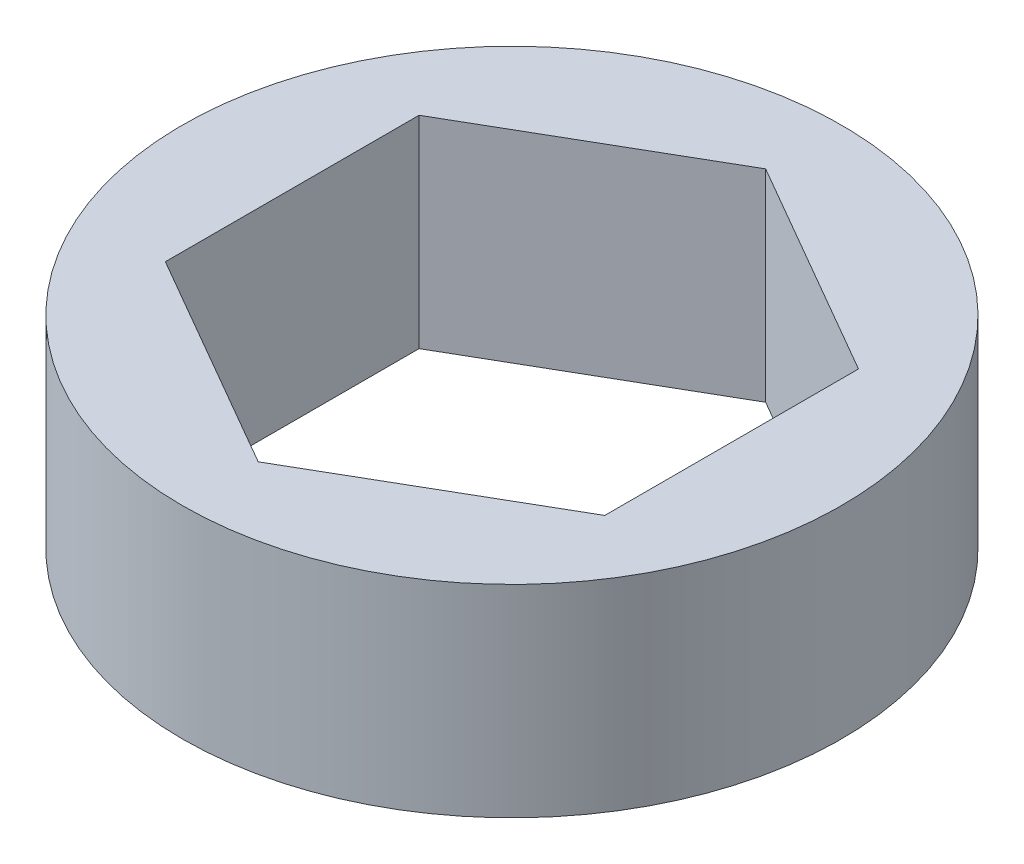
ISO-10303-21;
HEADER;
FILE_DESCRIPTION(('STEP AP214'),'2;1');
FILE_NAME('part.step','',(''),(''),'','','');
FILE_SCHEMA(('AUTOMOTIVE_DESIGN { 1 0 10303 214 1 1 1 1 }'));
ENDSEC;
DATA;
#1=APPLICATION_CONTEXT('core data for automotive mechanical design processes');
#2=APPLICATION_PROTOCOL_DEFINITION('international standard','automotive_design',2000,#1);
#3=PRODUCT_CONTEXT('',#1,'mechanical');
#4=PRODUCT('Part','Part','',(#3));
#5=PRODUCT_RELATED_PRODUCT_CATEGORY('part','',(#4));
#6=PRODUCT_DEFINITION_FORMATION('','',#4);
#7=PRODUCT_DEFINITION_CONTEXT('part definition',#1,'design');
#8=PRODUCT_DEFINITION('design','',#6,#7);
#9=PRODUCT_DEFINITION_SHAPE('','',#8);
#10=(LENGTH_UNIT() NAMED_UNIT(*) SI_UNIT(.MILLI.,.METRE.));
#11=(NAMED_UNIT(*) PLANE_ANGLE_UNIT() SI_UNIT($,.RADIAN.));
#12=(NAMED_UNIT(*) SI_UNIT($,.STERADIAN.) SOLID_ANGLE_UNIT());
#13=UNCERTAINTY_MEASURE_WITH_UNIT(LENGTH_MEASURE(1.E-05),#10,'distance_accuracy_value','');
#14=(GEOMETRIC_REPRESENTATION_CONTEXT(3) GLOBAL_UNCERTAINTY_ASSIGNED_CONTEXT((#13)) GLOBAL_UNIT_ASSIGNED_CONTEXT((#10,
#11,#12)) REPRESENTATION_CONTEXT('',''));
#15=CARTESIAN_POINT('',(0.,0.,0.));
#16=DIRECTION('',(0.,0.,1.));
#17=DIRECTION('',(1.,0.,0.));
#18=AXIS2_PLACEMENT_3D('',#15,#16,#17);
#19=CARTESIAN_POINT('',(0.,5.842,0.));
#20=DIRECTION('',(0.,1.,0.));
#21=DIRECTION('',(0.,0.,1.));
#22=AXIS2_PLACEMENT_3D('',#19,#20,#21);
#23=PLANE('',#22);
#24=CARTESIAN_POINT('',(0.,5.842,0.));
#25=DIRECTION('',(0.,1.,0.));
#26=DIRECTION('',(0.,0.,1.));
#27=AXIS2_PLACEMENT_3D('',#24,#25,#26);
#28=CIRCLE('',#27,9.525);
#29=CARTESIAN_POINT('',(0.,5.842,9.525));
#30=VERTEX_POINT('',#29);
#31=EDGE_CURVE('E11',#30,#30,#28,.T.);
#32=ORIENTED_EDGE('',*,*,#31,.T.);
#33=EDGE_LOOP('',(#32));
#34=FACE_BOUND('',#33,.T.);
#35=DIRECTION('',(-0.866025403784438,0.,0.500000000000001));
#36=VECTOR('',#35,1.);
#37=CARTESIAN_POINT('',(0.,5.842,-7.33234841870823));
#38=LINE('',#37,#36);
#39=CARTESIAN_POINT('',(0.,5.842,-7.33234841870823));
#40=VERTEX_POINT('',#39);
#41=CARTESIAN_POINT('',(-6.35,5.842,-3.6661742093541));
#42=VERTEX_POINT('',#41);
#43=EDGE_CURVE('E96',#40,#42,#38,.T.);
#44=ORIENTED_EDGE('',*,*,#43,.F.);
#45=DIRECTION('',(-0.866025403784442,0.,-0.499999999999995));
#46=VECTOR('',#45,1.);
#47=CARTESIAN_POINT('',(6.34999999999995,5.842,-3.66617420935419));
#48=LINE('',#47,#46);
#49=CARTESIAN_POINT('',(6.34999999999995,5.842,-3.66617420935419));
#50=VERTEX_POINT('',#49);
#51=EDGE_CURVE('E88',#50,#40,#48,.T.);
#52=ORIENTED_EDGE('',*,*,#51,.F.);
#53=DIRECTION('',(0.,0.,-1.));
#54=VECTOR('',#53,1.);
#55=CARTESIAN_POINT('',(6.35000000000002,5.842,3.66617420935406));
#56=LINE('',#55,#54);
#57=CARTESIAN_POINT('',(6.35000000000002,5.842,3.66617420935406));
#58=VERTEX_POINT('',#57);
#59=EDGE_CURVE('E116',#58,#50,#56,.T.);
#60=ORIENTED_EDGE('',*,*,#59,.F.);
#61=DIRECTION('',(0.866025403784434,0.,-0.500000000000007));
#62=VECTOR('',#61,1.);
#63=CARTESIAN_POINT('',(0.,5.842,7.33234841870823));
#64=LINE('',#63,#62);
#65=CARTESIAN_POINT('',(0.,5.842,7.33234841870823));
#66=VERTEX_POINT('',#65);
#67=EDGE_CURVE('E114',#66,#58,#64,.T.);
#68=ORIENTED_EDGE('',*,*,#67,.F.);
#69=DIRECTION('',(0.866025403784442,0.,0.499999999999995));
#70=VECTOR('',#69,1.);
#71=CARTESIAN_POINT('',(-6.34999999999997,5.842,3.66617420935415));
#72=LINE('',#71,#70);
#73=CARTESIAN_POINT('',(-6.34999999999997,5.842,3.66617420935415));
#74=VERTEX_POINT('',#73);
#75=EDGE_CURVE('E110',#74,#66,#72,.T.);
#76=ORIENTED_EDGE('',*,*,#75,.F.);
#77=DIRECTION('',(0.,0.,1.));
#78=VECTOR('',#77,1.);
#79=CARTESIAN_POINT('',(-6.35,5.842,-3.6661742093541));
#80=LINE('',#79,#78);
#81=EDGE_CURVE('E108',#42,#74,#80,.T.);
#82=ORIENTED_EDGE('',*,*,#81,.F.);
#83=EDGE_LOOP('',(#44,#52,#60,#68,#76,#82));
#84=FACE_BOUND('',#83,.T.);
#85=ADVANCED_FACE('F35',(#34,#84),#23,.T.);
#86=CARTESIAN_POINT('',(0.,0.,0.));
#87=DIRECTION('',(0.,1.,0.));
#88=DIRECTION('',(0.,0.,1.));
#89=AXIS2_PLACEMENT_3D('',#86,#87,#88);
#90=PLANE('',#89);
#91=CARTESIAN_POINT('',(0.,0.,0.));
#92=DIRECTION('',(0.,1.,0.));
#93=DIRECTION('',(0.,0.,1.));
#94=AXIS2_PLACEMENT_3D('',#91,#92,#93);
#95=CIRCLE('',#94,9.525);
#96=CARTESIAN_POINT('',(0.,0.,9.525));
#97=VERTEX_POINT('',#96);
#98=EDGE_CURVE('E39',#97,#97,#95,.T.);
#99=ORIENTED_EDGE('',*,*,#98,.F.);
#100=EDGE_LOOP('',(#99));
#101=FACE_BOUND('',#100,.T.);
#102=DIRECTION('',(-0.866025403784442,0.,-0.499999999999995));
#103=VECTOR('',#102,1.);
#104=CARTESIAN_POINT('',(6.34999999999995,0.,-3.66617420935419));
#105=LINE('',#104,#103);
#106=CARTESIAN_POINT('',(6.34999999999995,0.,-3.66617420935419));
#107=VERTEX_POINT('',#106);
#108=CARTESIAN_POINT('',(0.,0.,-7.33234841870823));
#109=VERTEX_POINT('',#108);
#110=EDGE_CURVE('E58',#107,#109,#105,.T.);
#111=ORIENTED_EDGE('',*,*,#110,.T.);
#112=DIRECTION('',(-0.866025403784438,0.,0.500000000000001));
#113=VECTOR('',#112,1.);
#114=CARTESIAN_POINT('',(0.,0.,-7.33234841870823));
#115=LINE('',#114,#113);
#116=CARTESIAN_POINT('',(-6.35,0.,-3.6661742093541));
#117=VERTEX_POINT('',#116);
#118=EDGE_CURVE('E103',#109,#117,#115,.T.);
#119=ORIENTED_EDGE('',*,*,#118,.T.);
#120=DIRECTION('',(0.,0.,1.));
#121=VECTOR('',#120,1.);
#122=CARTESIAN_POINT('',(-6.35,0.,-3.6661742093541));
#123=LINE('',#122,#121);
#124=CARTESIAN_POINT('',(-6.34999999999997,0.,3.66617420935415));
#125=VERTEX_POINT('',#124);
#126=EDGE_CURVE('E120',#117,#125,#123,.T.);
#127=ORIENTED_EDGE('',*,*,#126,.T.);
#128=DIRECTION('',(0.866025403784442,0.,0.499999999999995));
#129=VECTOR('',#128,1.);
#130=CARTESIAN_POINT('',(-6.34999999999997,0.,3.66617420935415));
#131=LINE('',#130,#129);
#132=CARTESIAN_POINT('',(0.,0.,7.33234841870823));
#133=VERTEX_POINT('',#132);
#134=EDGE_CURVE('E123',#125,#133,#131,.T.);
#135=ORIENTED_EDGE('',*,*,#134,.T.);
#136=DIRECTION('',(0.866025403784434,0.,-0.500000000000007));
#137=VECTOR('',#136,1.);
#138=CARTESIAN_POINT('',(0.,0.,7.33234841870823));
#139=LINE('',#138,#137);
#140=CARTESIAN_POINT('',(6.35000000000002,0.,3.66617420935406));
#141=VERTEX_POINT('',#140);
#142=EDGE_CURVE('E126',#133,#141,#139,.T.);
#143=ORIENTED_EDGE('',*,*,#142,.T.);
#144=DIRECTION('',(0.,0.,-1.));
#145=VECTOR('',#144,1.);
#146=CARTESIAN_POINT('',(6.35000000000002,0.,3.66617420935406));
#147=LINE('',#146,#145);
#148=EDGE_CURVE('E97',#141,#107,#147,.T.);
#149=ORIENTED_EDGE('',*,*,#148,.T.);
#150=EDGE_LOOP('',(#111,#119,#127,#135,#143,#149));
#151=FACE_BOUND('',#150,.T.);
#152=ADVANCED_FACE('F143',(#101,#151),#90,.F.);
#153=CARTESIAN_POINT('',(0.,5.842,0.));
#154=DIRECTION('',(0.,-1.,0.));
#155=DIRECTION('',(0.,0.,-1.));
#156=AXIS2_PLACEMENT_3D('',#153,#154,#155);
#157=CYLINDRICAL_SURFACE('',#156,9.525);
#158=ORIENTED_EDGE('',*,*,#31,.F.);
#159=EDGE_LOOP('',(#158));
#160=FACE_BOUND('',#159,.T.);
#161=ORIENTED_EDGE('',*,*,#98,.T.);
#162=EDGE_LOOP('',(#161));
#163=FACE_BOUND('',#162,.T.);
#164=ADVANCED_FACE('F37',(#160,#163),#157,.T.);
#165=CARTESIAN_POINT('',(6.34999999999995,5.842,-3.66617420935419));
#166=DIRECTION('',(-0.499999999999995,0.,0.866025403784441));
#167=DIRECTION('',(0.866025403784442,0.,0.499999999999995));
#168=AXIS2_PLACEMENT_3D('',#165,#166,#167);
#169=PLANE('',#168);
#170=ORIENTED_EDGE('',*,*,#110,.F.);
#171=DIRECTION('',(0.,-1.,0.));
#172=VECTOR('',#171,1.);
#173=CARTESIAN_POINT('',(6.34999999999995,5.842,-3.66617420935419));
#174=LINE('',#173,#172);
#175=EDGE_CURVE('E92',#50,#107,#174,.T.);
#176=ORIENTED_EDGE('',*,*,#175,.F.);
#177=ORIENTED_EDGE('',*,*,#51,.T.);
#178=DIRECTION('',(0.,-1.,0.));
#179=VECTOR('',#178,1.);
#180=CARTESIAN_POINT('',(0.,5.842,-7.33234841870823));
#181=LINE('',#180,#179);
#182=EDGE_CURVE('E91',#40,#109,#181,.T.);
#183=ORIENTED_EDGE('',*,*,#182,.T.);
#184=EDGE_LOOP('',(#170,#176,#177,#183));
#185=FACE_BOUND('',#184,.T.);
#186=ADVANCED_FACE('F90',(#185),#169,.T.);
#187=CARTESIAN_POINT('',(0.,5.842,-7.33234841870823));
#188=DIRECTION('',(0.500000000000001,0.,0.866025403784438));
#189=DIRECTION('',(0.866025403784438,0.,-0.500000000000001));
#190=AXIS2_PLACEMENT_3D('',#187,#188,#189);
#191=PLANE('',#190);
#192=ORIENTED_EDGE('',*,*,#118,.F.);
#193=ORIENTED_EDGE('',*,*,#182,.F.);
#194=ORIENTED_EDGE('',*,*,#43,.T.);
#195=DIRECTION('',(0.,-1.,0.));
#196=VECTOR('',#195,1.);
#197=CARTESIAN_POINT('',(-6.35,5.842,-3.6661742093541));
#198=LINE('',#197,#196);
#199=EDGE_CURVE('E104',#42,#117,#198,.T.);
#200=ORIENTED_EDGE('',*,*,#199,.T.);
#201=EDGE_LOOP('',(#192,#193,#194,#200));
#202=FACE_BOUND('',#201,.T.);
#203=ADVANCED_FACE('F100',(#202),#191,.T.);
#204=CARTESIAN_POINT('',(-6.35,5.842,-3.6661742093541));
#205=DIRECTION('',(1.,0.,0.));
#206=DIRECTION('',(0.,0.,-1.));
#207=AXIS2_PLACEMENT_3D('',#204,#205,#206);
#208=PLANE('',#207);
#209=ORIENTED_EDGE('',*,*,#126,.F.);
#210=ORIENTED_EDGE('',*,*,#199,.F.);
#211=ORIENTED_EDGE('',*,*,#81,.T.);
#212=DIRECTION('',(0.,-1.,0.));
#213=VECTOR('',#212,1.);
#214=CARTESIAN_POINT('',(-6.34999999999997,5.842,3.66617420935415));
#215=LINE('',#214,#213);
#216=EDGE_CURVE('E135',#74,#125,#215,.T.);
#217=ORIENTED_EDGE('',*,*,#216,.T.);
#218=EDGE_LOOP('',(#209,#210,#211,#217));
#219=FACE_BOUND('',#218,.T.);
#220=ADVANCED_FACE('F139',(#219),#208,.T.);
#221=CARTESIAN_POINT('',(-6.34999999999997,5.842,3.66617420935415));
#222=DIRECTION('',(0.499999999999995,0.,-0.866025403784441));
#223=DIRECTION('',(-0.866025403784442,0.,-0.499999999999995));
#224=AXIS2_PLACEMENT_3D('',#221,#222,#223);
#225=PLANE('',#224);
#226=ORIENTED_EDGE('',*,*,#134,.F.);
#227=ORIENTED_EDGE('',*,*,#216,.F.);
#228=ORIENTED_EDGE('',*,*,#75,.T.);
#229=DIRECTION('',(0.,-1.,0.));
#230=VECTOR('',#229,1.);
#231=CARTESIAN_POINT('',(0.,5.842,7.33234841870823));
#232=LINE('',#231,#230);
#233=EDGE_CURVE('E133',#66,#133,#232,.T.);
#234=ORIENTED_EDGE('',*,*,#233,.T.);
#235=EDGE_LOOP('',(#226,#227,#228,#234));
#236=FACE_BOUND('',#235,.T.);
#237=ADVANCED_FACE('F151',(#236),#225,.T.);
#238=CARTESIAN_POINT('',(0.,5.842,7.33234841870823));
#239=DIRECTION('',(-0.500000000000007,0.,-0.866025403784434));
#240=DIRECTION('',(-0.866025403784435,0.,0.500000000000007));
#241=AXIS2_PLACEMENT_3D('',#238,#239,#240);
#242=PLANE('',#241);
#243=ORIENTED_EDGE('',*,*,#142,.F.);
#244=ORIENTED_EDGE('',*,*,#233,.F.);
#245=ORIENTED_EDGE('',*,*,#67,.T.);
#246=DIRECTION('',(0.,-1.,0.));
#247=VECTOR('',#246,1.);
#248=CARTESIAN_POINT('',(6.35000000000002,5.842,3.66617420935406));
#249=LINE('',#248,#247);
#250=EDGE_CURVE('E50',#58,#141,#249,.T.);
#251=ORIENTED_EDGE('',*,*,#250,.T.);
#252=EDGE_LOOP('',(#243,#244,#245,#251));
#253=FACE_BOUND('',#252,.T.);
#254=ADVANCED_FACE('F149',(#253),#242,.T.);
#255=CARTESIAN_POINT('',(6.35000000000002,5.842,3.66617420935406));
#256=DIRECTION('',(-1.,0.,0.));
#257=DIRECTION('',(0.,0.,1.));
#258=AXIS2_PLACEMENT_3D('',#255,#256,#257);
#259=PLANE('',#258);
#260=ORIENTED_EDGE('',*,*,#148,.F.);
#261=ORIENTED_EDGE('',*,*,#250,.F.);
#262=ORIENTED_EDGE('',*,*,#59,.T.);
#263=ORIENTED_EDGE('',*,*,#175,.T.);
#264=EDGE_LOOP('',(#260,#261,#262,#263));
#265=FACE_BOUND('',#264,.T.);
#266=ADVANCED_FACE('F145',(#265),#259,.T.);
#267=CLOSED_SHELL('',(#85,#152,#164,#186,#203,#220,#237,#254,#266));
#268=MANIFOLD_SOLID_BREP('B2',#267);
#269=ADVANCED_BREP_SHAPE_REPRESENTATION('',(#18,#268),#14);
#270=SHAPE_DEFINITION_REPRESENTATION(#9,#269);
ENDSEC;
END-ISO-10303-21;
